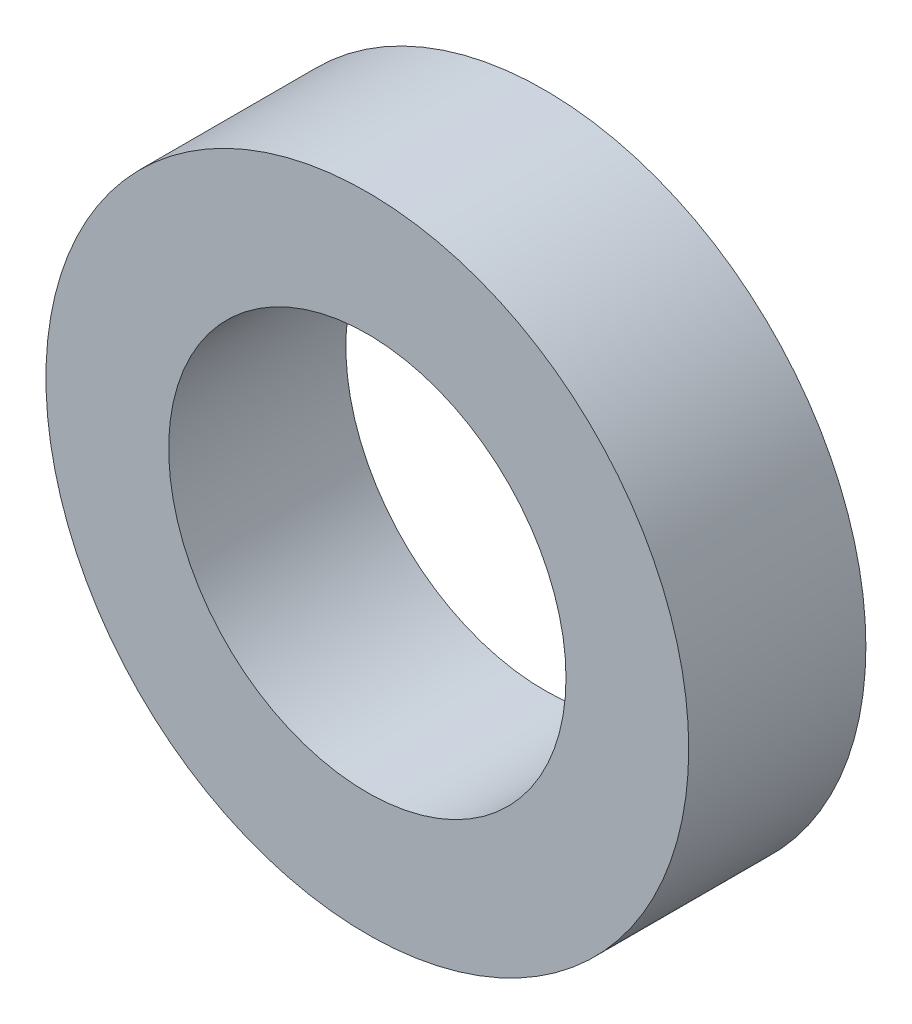
ISO-10303-21;
HEADER;
FILE_DESCRIPTION(('STEP AP214'),'2;1');
FILE_NAME('part.step','',(''),(''),'','','');
FILE_SCHEMA(('AUTOMOTIVE_DESIGN { 1 0 10303 214 1 1 1 1 }'));
ENDSEC;
DATA;
#1=APPLICATION_CONTEXT('core data for automotive mechanical design processes');
#2=APPLICATION_PROTOCOL_DEFINITION('international standard','automotive_design',2000,#1);
#3=PRODUCT_CONTEXT('',#1,'mechanical');
#4=PRODUCT('Part','Part','',(#3));
#5=PRODUCT_RELATED_PRODUCT_CATEGORY('part','',(#4));
#6=PRODUCT_DEFINITION_FORMATION('','',#4);
#7=PRODUCT_DEFINITION_CONTEXT('part definition',#1,'design');
#8=PRODUCT_DEFINITION('design','',#6,#7);
#9=PRODUCT_DEFINITION_SHAPE('','',#8);
#10=(LENGTH_UNIT() NAMED_UNIT(*) SI_UNIT(.MILLI.,.METRE.));
#11=(NAMED_UNIT(*) PLANE_ANGLE_UNIT() SI_UNIT($,.RADIAN.));
#12=(NAMED_UNIT(*) SI_UNIT($,.STERADIAN.) SOLID_ANGLE_UNIT());
#13=UNCERTAINTY_MEASURE_WITH_UNIT(LENGTH_MEASURE(1.E-05),#10,'distance_accuracy_value','');
#14=(GEOMETRIC_REPRESENTATION_CONTEXT(3) GLOBAL_UNCERTAINTY_ASSIGNED_CONTEXT((#13)) GLOBAL_UNIT_ASSIGNED_CONTEXT((#10,
#11,#12)) REPRESENTATION_CONTEXT('',''));
#15=CARTESIAN_POINT('',(0.,0.,0.));
#16=DIRECTION('',(0.,0.,1.));
#17=DIRECTION('',(1.,0.,0.));
#18=AXIS2_PLACEMENT_3D('',#15,#16,#17);
#19=CARTESIAN_POINT('',(0.,0.,35.));
#20=DIRECTION('',(0.,0.,1.));
#21=DIRECTION('',(1.,0.,0.));
#22=AXIS2_PLACEMENT_3D('',#19,#20,#21);
#23=PLANE('',#22);
#24=CARTESIAN_POINT('',(0.,0.,35.));
#25=DIRECTION('',(0.,0.,1.));
#26=DIRECTION('',(1.,0.,0.));
#27=AXIS2_PLACEMENT_3D('',#24,#25,#26);
#28=CIRCLE('',#27,127.);
#29=CARTESIAN_POINT('',(127.,0.,35.));
#30=VERTEX_POINT('',#29);
#31=EDGE_CURVE('E10',#30,#30,#28,.T.);
#32=ORIENTED_EDGE('',*,*,#31,.T.);
#33=EDGE_LOOP('',(#32));
#34=FACE_BOUND('',#33,.T.);
#35=CARTESIAN_POINT('',(0.,0.,35.));
#36=DIRECTION('',(0.,0.,1.));
#37=DIRECTION('',(1.,0.,0.));
#38=AXIS2_PLACEMENT_3D('',#35,#36,#37);
#39=CIRCLE('',#38,78.5);
#40=CARTESIAN_POINT('',(78.5,0.,35.));
#41=VERTEX_POINT('',#40);
#42=EDGE_CURVE('E49',#41,#41,#39,.T.);
#43=ORIENTED_EDGE('',*,*,#42,.F.);
#44=EDGE_LOOP('',(#43));
#45=FACE_BOUND('',#44,.T.);
#46=ADVANCED_FACE('F36',(#34,#45),#23,.T.);
#47=CARTESIAN_POINT('',(0.,0.,-35.));
#48=DIRECTION('',(0.,0.,1.));
#49=DIRECTION('',(1.,0.,0.));
#50=AXIS2_PLACEMENT_3D('',#47,#48,#49);
#51=PLANE('',#50);
#52=CARTESIAN_POINT('',(0.,0.,-35.));
#53=DIRECTION('',(0.,0.,1.));
#54=DIRECTION('',(1.,0.,0.));
#55=AXIS2_PLACEMENT_3D('',#52,#53,#54);
#56=CIRCLE('',#55,127.);
#57=CARTESIAN_POINT('',(127.,0.,-35.));
#58=VERTEX_POINT('',#57);
#59=EDGE_CURVE('E40',#58,#58,#56,.T.);
#60=ORIENTED_EDGE('',*,*,#59,.F.);
#61=EDGE_LOOP('',(#60));
#62=FACE_BOUND('',#61,.T.);
#63=CARTESIAN_POINT('',(0.,0.,-35.));
#64=DIRECTION('',(0.,0.,1.));
#65=DIRECTION('',(1.,0.,0.));
#66=AXIS2_PLACEMENT_3D('',#63,#64,#65);
#67=CIRCLE('',#66,78.5);
#68=CARTESIAN_POINT('',(78.5,0.,-35.));
#69=VERTEX_POINT('',#68);
#70=EDGE_CURVE('E51',#69,#69,#67,.T.);
#71=ORIENTED_EDGE('',*,*,#70,.T.);
#72=EDGE_LOOP('',(#71));
#73=FACE_BOUND('',#72,.T.);
#74=ADVANCED_FACE('F63',(#62,#73),#51,.F.);
#75=CARTESIAN_POINT('',(0.,0.,35.));
#76=DIRECTION('',(0.,0.,-1.));
#77=DIRECTION('',(-1.,0.,0.));
#78=AXIS2_PLACEMENT_3D('',#75,#76,#77);
#79=CYLINDRICAL_SURFACE('',#78,127.);
#80=ORIENTED_EDGE('',*,*,#31,.F.);
#81=EDGE_LOOP('',(#80));
#82=FACE_BOUND('',#81,.T.);
#83=ORIENTED_EDGE('',*,*,#59,.T.);
#84=EDGE_LOOP('',(#83));
#85=FACE_BOUND('',#84,.T.);
#86=ADVANCED_FACE('F38',(#82,#85),#79,.T.);
#87=CARTESIAN_POINT('',(0.,0.,35.));
#88=DIRECTION('',(0.,0.,-1.));
#89=DIRECTION('',(-1.,0.,0.));
#90=AXIS2_PLACEMENT_3D('',#87,#88,#89);
#91=CYLINDRICAL_SURFACE('',#90,78.5);
#92=ORIENTED_EDGE('',*,*,#42,.T.);
#93=EDGE_LOOP('',(#92));
#94=FACE_BOUND('',#93,.T.);
#95=ORIENTED_EDGE('',*,*,#70,.F.);
#96=EDGE_LOOP('',(#95));
#97=FACE_BOUND('',#96,.T.);
#98=ADVANCED_FACE('F59',(#94,#97),#91,.F.);
#99=CLOSED_SHELL('',(#46,#74,#86,#98));
#100=MANIFOLD_SOLID_BREP('B2',#99);
#101=ADVANCED_BREP_SHAPE_REPRESENTATION('',(#18,#100),#14);
#102=SHAPE_DEFINITION_REPRESENTATION(#9,#101);
ENDSEC;
END-ISO-10303-21;
